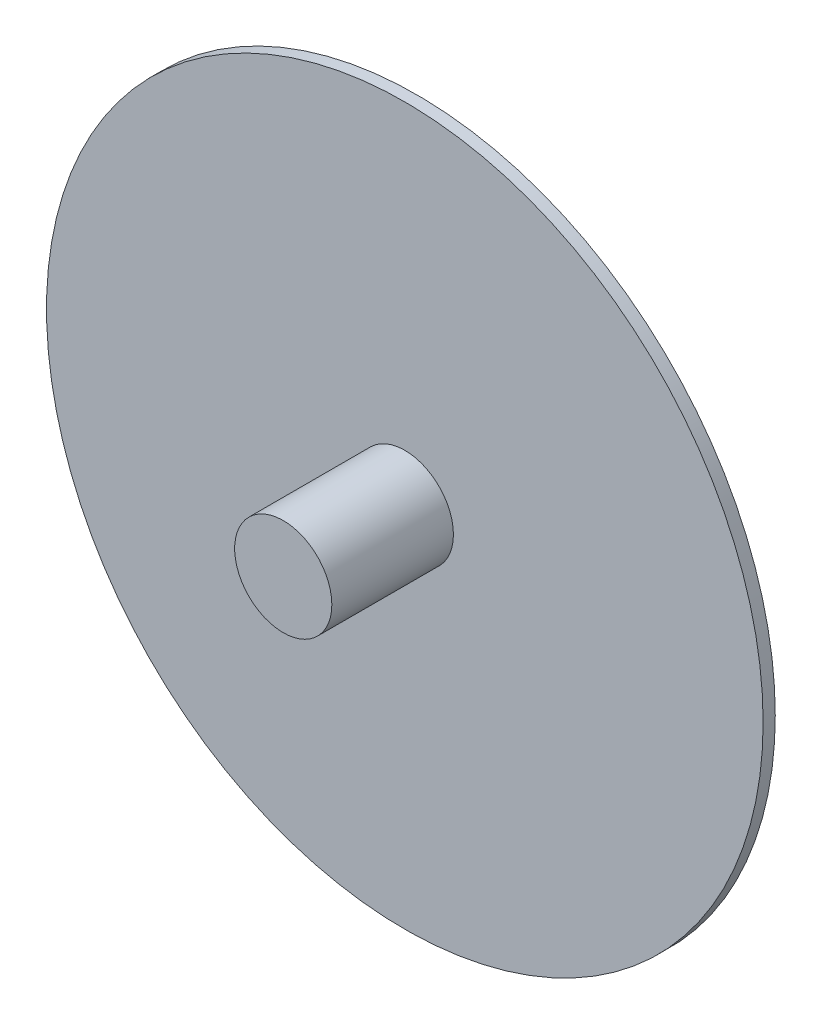
ISO-10303-21;
HEADER;
FILE_DESCRIPTION(('STEP AP214'),'2;1');
FILE_NAME('part.step','',(''),(''),'','','');
FILE_SCHEMA(('AUTOMOTIVE_DESIGN { 1 0 10303 214 1 1 1 1 }'));
ENDSEC;
DATA;
#1=APPLICATION_CONTEXT('core data for automotive mechanical design processes');
#2=APPLICATION_PROTOCOL_DEFINITION('international standard','automotive_design',2000,#1);
#3=PRODUCT_CONTEXT('',#1,'mechanical');
#4=PRODUCT('Part','Part','',(#3));
#5=PRODUCT_RELATED_PRODUCT_CATEGORY('part','',(#4));
#6=PRODUCT_DEFINITION_FORMATION('','',#4);
#7=PRODUCT_DEFINITION_CONTEXT('part definition',#1,'design');
#8=PRODUCT_DEFINITION('design','',#6,#7);
#9=PRODUCT_DEFINITION_SHAPE('','',#8);
#10=(LENGTH_UNIT() NAMED_UNIT(*) SI_UNIT(.MILLI.,.METRE.));
#11=(NAMED_UNIT(*) PLANE_ANGLE_UNIT() SI_UNIT($,.RADIAN.));
#12=(NAMED_UNIT(*) SI_UNIT($,.STERADIAN.) SOLID_ANGLE_UNIT());
#13=UNCERTAINTY_MEASURE_WITH_UNIT(LENGTH_MEASURE(1.E-05),#10,'distance_accuracy_value','');
#14=(GEOMETRIC_REPRESENTATION_CONTEXT(3) GLOBAL_UNCERTAINTY_ASSIGNED_CONTEXT((#13)) GLOBAL_UNIT_ASSIGNED_CONTEXT((#10,
#11,#12)) REPRESENTATION_CONTEXT('',''));
#15=CARTESIAN_POINT('',(0.,0.,0.));
#16=DIRECTION('',(0.,0.,1.));
#17=DIRECTION('',(1.,0.,0.));
#18=AXIS2_PLACEMENT_3D('',#15,#16,#17);
#19=CARTESIAN_POINT('',(0.,-0.654398217356447,1.));
#20=DIRECTION('',(0.,0.,-1.));
#21=DIRECTION('',(-1.,0.,0.));
#22=AXIS2_PLACEMENT_3D('',#19,#20,#21);
#23=CYLINDRICAL_SURFACE('',#22,29.5);
#24=CARTESIAN_POINT('',(0.,-0.654398217356447,1.));
#25=DIRECTION('',(0.,0.,1.));
#26=DIRECTION('',(1.,0.,0.));
#27=AXIS2_PLACEMENT_3D('',#24,#25,#26);
#28=CIRCLE('',#27,29.5);
#29=CARTESIAN_POINT('',(29.5,-0.654398217356447,1.));
#30=VERTEX_POINT('',#29);
#31=EDGE_CURVE('E10',#30,#30,#28,.T.);
#32=ORIENTED_EDGE('',*,*,#31,.F.);
#33=EDGE_LOOP('',(#32));
#34=FACE_BOUND('',#33,.T.);
#35=CARTESIAN_POINT('',(0.,-0.654398217356447,0.));
#36=DIRECTION('',(0.,0.,1.));
#37=DIRECTION('',(1.,0.,0.));
#38=AXIS2_PLACEMENT_3D('',#35,#36,#37);
#39=CIRCLE('',#38,29.5);
#40=CARTESIAN_POINT('',(29.5,-0.654398217356447,0.));
#41=VERTEX_POINT('',#40);
#42=EDGE_CURVE('E38',#41,#41,#39,.T.);
#43=ORIENTED_EDGE('',*,*,#42,.T.);
#44=EDGE_LOOP('',(#43));
#45=FACE_BOUND('',#44,.T.);
#46=ADVANCED_FACE('F35',(#34,#45),#23,.T.);
#47=CARTESIAN_POINT('',(0.,-0.654398217356447,1.));
#48=DIRECTION('',(0.,0.,1.));
#49=DIRECTION('',(1.,0.,0.));
#50=AXIS2_PLACEMENT_3D('',#47,#48,#49);
#51=PLANE('',#50);
#52=CARTESIAN_POINT('',(0.,0.,1.));
#53=DIRECTION('',(0.,0.,1.));
#54=DIRECTION('',(1.,0.,0.));
#55=AXIS2_PLACEMENT_3D('',#52,#53,#54);
#56=CIRCLE('',#55,4.);
#57=CARTESIAN_POINT('',(4.,0.,1.));
#58=VERTEX_POINT('',#57);
#59=EDGE_CURVE('E47',#58,#58,#56,.T.);
#60=ORIENTED_EDGE('',*,*,#59,.F.);
#61=EDGE_LOOP('',(#60));
#62=FACE_BOUND('',#61,.T.);
#63=ORIENTED_EDGE('',*,*,#31,.T.);
#64=EDGE_LOOP('',(#63));
#65=FACE_BOUND('',#64,.T.);
#66=ADVANCED_FACE('F62',(#62,#65),#51,.T.);
#67=CARTESIAN_POINT('',(0.,-0.654398217356447,0.));
#68=DIRECTION('',(0.,0.,1.));
#69=DIRECTION('',(1.,0.,0.));
#70=AXIS2_PLACEMENT_3D('',#67,#68,#69);
#71=PLANE('',#70);
#72=ORIENTED_EDGE('',*,*,#42,.F.);
#73=EDGE_LOOP('',(#72));
#74=FACE_BOUND('',#73,.T.);
#75=ADVANCED_FACE('F58',(#74),#71,.F.);
#76=CARTESIAN_POINT('',(0.,0.,11.01));
#77=DIRECTION('',(0.,0.,-1.));
#78=DIRECTION('',(-1.,0.,0.));
#79=AXIS2_PLACEMENT_3D('',#76,#77,#78);
#80=CYLINDRICAL_SURFACE('',#79,4.);
#81=CARTESIAN_POINT('',(0.,0.,11.01));
#82=DIRECTION('',(0.,0.,1.));
#83=DIRECTION('',(1.,0.,0.));
#84=AXIS2_PLACEMENT_3D('',#81,#82,#83);
#85=CIRCLE('',#84,4.);
#86=CARTESIAN_POINT('',(4.,0.,11.01));
#87=VERTEX_POINT('',#86);
#88=EDGE_CURVE('E45',#87,#87,#85,.T.);
#89=ORIENTED_EDGE('',*,*,#88,.F.);
#90=EDGE_LOOP('',(#89));
#91=FACE_BOUND('',#90,.T.);
#92=ORIENTED_EDGE('',*,*,#59,.T.);
#93=EDGE_LOOP('',(#92));
#94=FACE_BOUND('',#93,.T.);
#95=ADVANCED_FACE('F55',(#91,#94),#80,.T.);
#96=CARTESIAN_POINT('',(0.,0.,11.01));
#97=DIRECTION('',(0.,0.,1.));
#98=DIRECTION('',(1.,0.,0.));
#99=AXIS2_PLACEMENT_3D('',#96,#97,#98);
#100=PLANE('',#99);
#101=ORIENTED_EDGE('',*,*,#88,.T.);
#102=EDGE_LOOP('',(#101));
#103=FACE_BOUND('',#102,.T.);
#104=ADVANCED_FACE('F53',(#103),#100,.T.);
#105=CLOSED_SHELL('',(#46,#66,#75,#95,#104));
#106=MANIFOLD_SOLID_BREP('B2',#105);
#107=ADVANCED_BREP_SHAPE_REPRESENTATION('',(#18,#106),#14);
#108=SHAPE_DEFINITION_REPRESENTATION(#9,#107);
ENDSEC;
END-ISO-10303-21;
